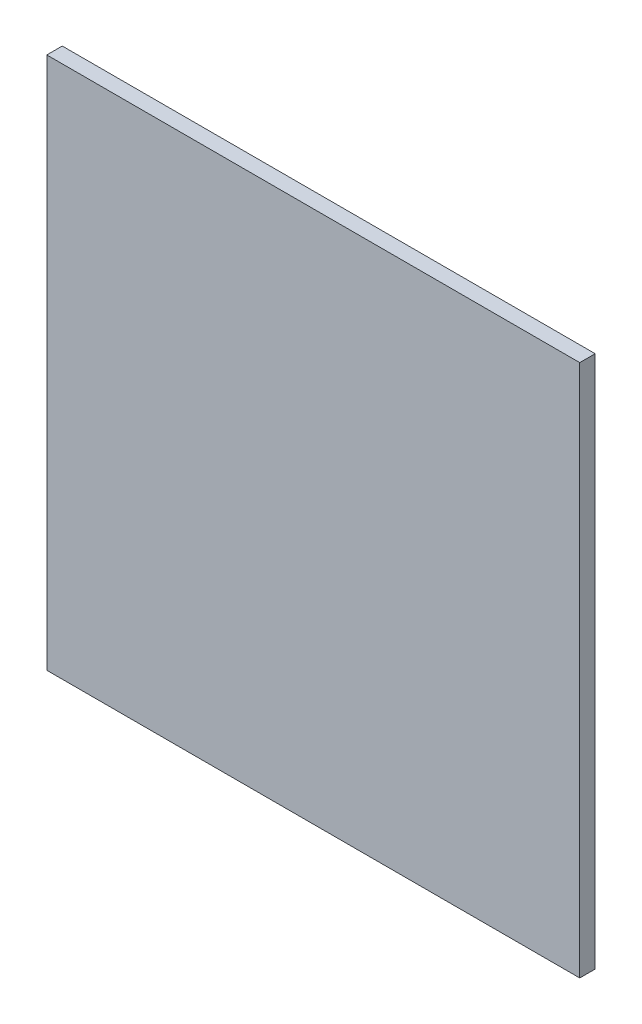
ISO-10303-21;
HEADER;
FILE_DESCRIPTION(('STEP AP214'),'2;1');
FILE_NAME('part.step','',(''),(''),'','','');
FILE_SCHEMA(('AUTOMOTIVE_DESIGN { 1 0 10303 214 1 1 1 1 }'));
ENDSEC;
DATA;
#1=APPLICATION_CONTEXT('core data for automotive mechanical design processes');
#2=APPLICATION_PROTOCOL_DEFINITION('international standard','automotive_design',2000,#1);
#3=PRODUCT_CONTEXT('',#1,'mechanical');
#4=PRODUCT('Part','Part','',(#3));
#5=PRODUCT_RELATED_PRODUCT_CATEGORY('part','',(#4));
#6=PRODUCT_DEFINITION_FORMATION('','',#4);
#7=PRODUCT_DEFINITION_CONTEXT('part definition',#1,'design');
#8=PRODUCT_DEFINITION('design','',#6,#7);
#9=PRODUCT_DEFINITION_SHAPE('','',#8);
#10=(LENGTH_UNIT() NAMED_UNIT(*) SI_UNIT(.MILLI.,.METRE.));
#11=(NAMED_UNIT(*) PLANE_ANGLE_UNIT() SI_UNIT($,.RADIAN.));
#12=(NAMED_UNIT(*) SI_UNIT($,.STERADIAN.) SOLID_ANGLE_UNIT());
#13=UNCERTAINTY_MEASURE_WITH_UNIT(LENGTH_MEASURE(1.E-05),#10,'distance_accuracy_value','');
#14=(GEOMETRIC_REPRESENTATION_CONTEXT(3) GLOBAL_UNCERTAINTY_ASSIGNED_CONTEXT((#13)) GLOBAL_UNIT_ASSIGNED_CONTEXT((#10,
#11,#12)) REPRESENTATION_CONTEXT('',''));
#15=CARTESIAN_POINT('',(0.,0.,0.));
#16=DIRECTION('',(0.,0.,1.));
#17=DIRECTION('',(1.,0.,0.));
#18=AXIS2_PLACEMENT_3D('',#15,#16,#17);
#19=CARTESIAN_POINT('',(0.,0.,0.1));
#20=DIRECTION('',(0.,0.,1.));
#21=DIRECTION('',(1.,0.,0.));
#22=AXIS2_PLACEMENT_3D('',#19,#20,#21);
#23=PLANE('',#22);
#24=DIRECTION('',(1.,0.,0.));
#25=VECTOR('',#24,1.);
#26=CARTESIAN_POINT('',(-1.725,-1.725,0.1));
#27=LINE('',#26,#25);
#28=CARTESIAN_POINT('',(-1.725,-1.725,0.1));
#29=VERTEX_POINT('',#28);
#30=CARTESIAN_POINT('',(1.725,-1.725,0.1));
#31=VERTEX_POINT('',#30);
#32=EDGE_CURVE('E86',#29,#31,#27,.T.);
#33=ORIENTED_EDGE('',*,*,#32,.T.);
#34=DIRECTION('',(0.,1.,0.));
#35=VECTOR('',#34,1.);
#36=CARTESIAN_POINT('',(1.725,-1.725,0.1));
#37=LINE('',#36,#35);
#38=CARTESIAN_POINT('',(1.725,1.725,0.1));
#39=VERTEX_POINT('',#38);
#40=EDGE_CURVE('E54',#31,#39,#37,.T.);
#41=ORIENTED_EDGE('',*,*,#40,.T.);
#42=DIRECTION('',(-1.,0.,0.));
#43=VECTOR('',#42,1.);
#44=CARTESIAN_POINT('',(1.725,1.725,0.1));
#45=LINE('',#44,#43);
#46=CARTESIAN_POINT('',(-1.725,1.725,0.1));
#47=VERTEX_POINT('',#46);
#48=EDGE_CURVE('E78',#39,#47,#45,.T.);
#49=ORIENTED_EDGE('',*,*,#48,.T.);
#50=DIRECTION('',(0.,-1.,0.));
#51=VECTOR('',#50,1.);
#52=CARTESIAN_POINT('',(-1.725,1.725,0.1));
#53=LINE('',#52,#51);
#54=EDGE_CURVE('E11',#47,#29,#53,.T.);
#55=ORIENTED_EDGE('',*,*,#54,.T.);
#56=EDGE_LOOP('',(#33,#41,#49,#55));
#57=FACE_BOUND('',#56,.T.);
#58=ADVANCED_FACE('F16',(#57),#23,.T.);
#59=CARTESIAN_POINT('',(0.,0.,0.));
#60=DIRECTION('',(0.,0.,1.));
#61=DIRECTION('',(1.,0.,0.));
#62=AXIS2_PLACEMENT_3D('',#59,#60,#61);
#63=PLANE('',#62);
#64=DIRECTION('',(1.,0.,0.));
#65=VECTOR('',#64,1.);
#66=CARTESIAN_POINT('',(-1.725,-1.725,0.));
#67=LINE('',#66,#65);
#68=CARTESIAN_POINT('',(-1.725,-1.725,0.));
#69=VERTEX_POINT('',#68);
#70=CARTESIAN_POINT('',(1.725,-1.725,0.));
#71=VERTEX_POINT('',#70);
#72=EDGE_CURVE('E100',#69,#71,#67,.T.);
#73=ORIENTED_EDGE('',*,*,#72,.F.);
#74=DIRECTION('',(0.,-1.,0.));
#75=VECTOR('',#74,1.);
#76=CARTESIAN_POINT('',(-1.725,1.725,0.));
#77=LINE('',#76,#75);
#78=CARTESIAN_POINT('',(-1.725,1.725,0.));
#79=VERTEX_POINT('',#78);
#80=EDGE_CURVE('E27',#79,#69,#77,.T.);
#81=ORIENTED_EDGE('',*,*,#80,.F.);
#82=DIRECTION('',(-1.,0.,0.));
#83=VECTOR('',#82,1.);
#84=CARTESIAN_POINT('',(1.725,1.725,0.));
#85=LINE('',#84,#83);
#86=CARTESIAN_POINT('',(1.725,1.725,0.));
#87=VERTEX_POINT('',#86);
#88=EDGE_CURVE('E20',#87,#79,#85,.T.);
#89=ORIENTED_EDGE('',*,*,#88,.F.);
#90=DIRECTION('',(0.,1.,0.));
#91=VECTOR('',#90,1.);
#92=CARTESIAN_POINT('',(1.725,-1.725,0.));
#93=LINE('',#92,#91);
#94=EDGE_CURVE('E68',#71,#87,#93,.T.);
#95=ORIENTED_EDGE('',*,*,#94,.F.);
#96=EDGE_LOOP('',(#73,#81,#89,#95));
#97=FACE_BOUND('',#96,.T.);
#98=ADVANCED_FACE('F117',(#97),#63,.F.);
#99=CARTESIAN_POINT('',(-1.725,1.725,0.));
#100=DIRECTION('',(1.,0.,0.));
#101=DIRECTION('',(0.,1.,0.));
#102=AXIS2_PLACEMENT_3D('',#99,#100,#101);
#103=PLANE('',#102);
#104=DIRECTION('',(0.,0.,1.));
#105=VECTOR('',#104,1.);
#106=CARTESIAN_POINT('',(-1.725,1.725,0.));
#107=LINE('',#106,#105);
#108=EDGE_CURVE('E81',#79,#47,#107,.T.);
#109=ORIENTED_EDGE('',*,*,#108,.F.);
#110=ORIENTED_EDGE('',*,*,#80,.T.);
#111=DIRECTION('',(0.,0.,1.));
#112=VECTOR('',#111,1.);
#113=CARTESIAN_POINT('',(-1.725,-1.725,0.));
#114=LINE('',#113,#112);
#115=EDGE_CURVE('E104',#69,#29,#114,.T.);
#116=ORIENTED_EDGE('',*,*,#115,.T.);
#117=ORIENTED_EDGE('',*,*,#54,.F.);
#118=EDGE_LOOP('',(#109,#110,#116,#117));
#119=FACE_BOUND('',#118,.T.);
#120=ADVANCED_FACE('F114',(#119),#103,.F.);
#121=CARTESIAN_POINT('',(1.725,1.725,0.));
#122=DIRECTION('',(0.,-1.,0.));
#123=DIRECTION('',(0.,0.,-1.));
#124=AXIS2_PLACEMENT_3D('',#121,#122,#123);
#125=PLANE('',#124);
#126=DIRECTION('',(0.,0.,1.));
#127=VECTOR('',#126,1.);
#128=CARTESIAN_POINT('',(1.725,1.725,0.));
#129=LINE('',#128,#127);
#130=EDGE_CURVE('E80',#87,#39,#129,.T.);
#131=ORIENTED_EDGE('',*,*,#130,.F.);
#132=ORIENTED_EDGE('',*,*,#88,.T.);
#133=ORIENTED_EDGE('',*,*,#108,.T.);
#134=ORIENTED_EDGE('',*,*,#48,.F.);
#135=EDGE_LOOP('',(#131,#132,#133,#134));
#136=FACE_BOUND('',#135,.T.);
#137=ADVANCED_FACE('F18',(#136),#125,.F.);
#138=CARTESIAN_POINT('',(1.725,-1.725,0.));
#139=DIRECTION('',(-1.,0.,0.));
#140=DIRECTION('',(0.,0.,1.));
#141=AXIS2_PLACEMENT_3D('',#138,#139,#140);
#142=PLANE('',#141);
#143=DIRECTION('',(0.,0.,1.));
#144=VECTOR('',#143,1.);
#145=CARTESIAN_POINT('',(1.725,-1.725,0.));
#146=LINE('',#145,#144);
#147=EDGE_CURVE('E98',#71,#31,#146,.T.);
#148=ORIENTED_EDGE('',*,*,#147,.F.);
#149=ORIENTED_EDGE('',*,*,#94,.T.);
#150=ORIENTED_EDGE('',*,*,#130,.T.);
#151=ORIENTED_EDGE('',*,*,#40,.F.);
#152=EDGE_LOOP('',(#148,#149,#150,#151));
#153=FACE_BOUND('',#152,.T.);
#154=ADVANCED_FACE('F90',(#153),#142,.F.);
#155=CARTESIAN_POINT('',(-1.725,-1.725,0.));
#156=DIRECTION('',(0.,1.,0.));
#157=DIRECTION('',(1.,0.,0.));
#158=AXIS2_PLACEMENT_3D('',#155,#156,#157);
#159=PLANE('',#158);
#160=ORIENTED_EDGE('',*,*,#115,.F.);
#161=ORIENTED_EDGE('',*,*,#72,.T.);
#162=ORIENTED_EDGE('',*,*,#147,.T.);
#163=ORIENTED_EDGE('',*,*,#32,.F.);
#164=EDGE_LOOP('',(#160,#161,#162,#163));
#165=FACE_BOUND('',#164,.T.);
#166=ADVANCED_FACE('F116',(#165),#159,.F.);
#167=CLOSED_SHELL('',(#58,#98,#120,#137,#154,#166));
#168=MANIFOLD_SOLID_BREP('B1',#167);
#169=ADVANCED_BREP_SHAPE_REPRESENTATION('',(#18,#168),#14);
#170=SHAPE_DEFINITION_REPRESENTATION(#9,#169);
ENDSEC;
END-ISO-10303-21;
